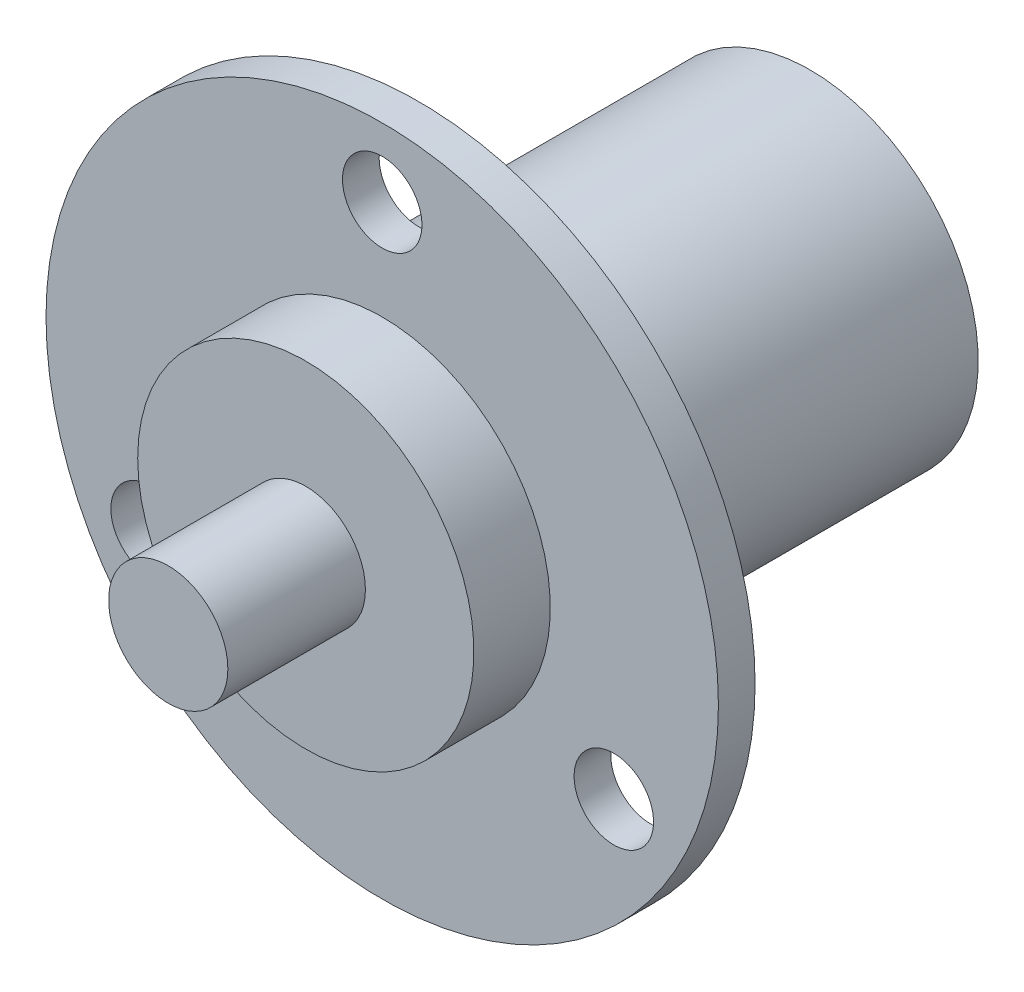
ISO-10303-21;
HEADER;
FILE_DESCRIPTION(('STEP AP214'),'2;1');
FILE_NAME('part.step','',(''),(''),'','','');
FILE_SCHEMA(('AUTOMOTIVE_DESIGN { 1 0 10303 214 1 1 1 1 }'));
ENDSEC;
DATA;
#1=APPLICATION_CONTEXT('core data for automotive mechanical design processes');
#2=APPLICATION_PROTOCOL_DEFINITION('international standard','automotive_design',2000,#1);
#3=PRODUCT_CONTEXT('',#1,'mechanical');
#4=PRODUCT('Part','Part','',(#3));
#5=PRODUCT_RELATED_PRODUCT_CATEGORY('part','',(#4));
#6=PRODUCT_DEFINITION_FORMATION('','',#4);
#7=PRODUCT_DEFINITION_CONTEXT('part definition',#1,'design');
#8=PRODUCT_DEFINITION('design','',#6,#7);
#9=PRODUCT_DEFINITION_SHAPE('','',#8);
#10=(LENGTH_UNIT() NAMED_UNIT(*) SI_UNIT(.MILLI.,.METRE.));
#11=(NAMED_UNIT(*) PLANE_ANGLE_UNIT() SI_UNIT($,.RADIAN.));
#12=(NAMED_UNIT(*) SI_UNIT($,.STERADIAN.) SOLID_ANGLE_UNIT());
#13=UNCERTAINTY_MEASURE_WITH_UNIT(LENGTH_MEASURE(1.E-05),#10,'distance_accuracy_value','');
#14=(GEOMETRIC_REPRESENTATION_CONTEXT(3) GLOBAL_UNCERTAINTY_ASSIGNED_CONTEXT((#13)) GLOBAL_UNIT_ASSIGNED_CONTEXT((#10,
#11,#12)) REPRESENTATION_CONTEXT('',''));
#15=CARTESIAN_POINT('',(0.,0.,0.));
#16=DIRECTION('',(0.,0.,1.));
#17=DIRECTION('',(1.,0.,0.));
#18=AXIS2_PLACEMENT_3D('',#15,#16,#17);
#19=CARTESIAN_POINT('',(0.,17.5,-16.4));
#20=DIRECTION('',(0.,0.,1.));
#21=DIRECTION('',(1.,0.,0.));
#22=AXIS2_PLACEMENT_3D('',#19,#20,#21);
#23=CYLINDRICAL_SURFACE('',#22,2.6);
#24=CARTESIAN_POINT('',(0.,17.5,-16.4));
#25=DIRECTION('',(0.,0.,-1.));
#26=DIRECTION('',(-1.,0.,0.));
#27=AXIS2_PLACEMENT_3D('',#24,#25,#26);
#28=CIRCLE('',#27,2.6);
#29=CARTESIAN_POINT('',(-2.6,17.5,-16.4));
#30=VERTEX_POINT('',#29);
#31=EDGE_CURVE('E48',#30,#30,#28,.T.);
#32=ORIENTED_EDGE('',*,*,#31,.T.);
#33=EDGE_LOOP('',(#32));
#34=FACE_BOUND('',#33,.T.);
#35=CARTESIAN_POINT('',(0.,17.5,-14.));
#36=DIRECTION('',(0.,0.,-1.));
#37=DIRECTION('',(-1.,0.,0.));
#38=AXIS2_PLACEMENT_3D('',#35,#36,#37);
#39=CIRCLE('',#38,2.6);
#40=CARTESIAN_POINT('',(-2.6,17.5,-14.));
#41=VERTEX_POINT('',#40);
#42=EDGE_CURVE('E63',#41,#41,#39,.T.);
#43=ORIENTED_EDGE('',*,*,#42,.F.);
#44=EDGE_LOOP('',(#43));
#45=FACE_BOUND('',#44,.T.);
#46=ADVANCED_FACE('F40',(#34,#45),#23,.F.);
#47=CARTESIAN_POINT('',(-15.1554445662288,-8.74999999999936,-16.4));
#48=DIRECTION('',(0.,0.,1.));
#49=DIRECTION('',(1.,0.,0.));
#50=AXIS2_PLACEMENT_3D('',#47,#48,#49);
#51=CYLINDRICAL_SURFACE('',#50,2.60000000000096);
#52=CARTESIAN_POINT('',(-15.1554445662288,-8.74999999999936,-16.4));
#53=DIRECTION('',(0.,0.,-1.));
#54=DIRECTION('',(-1.,0.,0.));
#55=AXIS2_PLACEMENT_3D('',#52,#53,#54);
#56=CIRCLE('',#55,2.60000000000096);
#57=CARTESIAN_POINT('',(-17.7554445662298,-8.74999999999936,-16.4));
#58=VERTEX_POINT('',#57);
#59=EDGE_CURVE('E53',#58,#58,#56,.T.);
#60=ORIENTED_EDGE('',*,*,#59,.T.);
#61=EDGE_LOOP('',(#60));
#62=FACE_BOUND('',#61,.T.);
#63=CARTESIAN_POINT('',(-15.1554445662288,-8.74999999999936,-14.));
#64=DIRECTION('',(0.,0.,-1.));
#65=DIRECTION('',(-1.,0.,0.));
#66=AXIS2_PLACEMENT_3D('',#63,#64,#65);
#67=CIRCLE('',#66,2.60000000000096);
#68=CARTESIAN_POINT('',(-17.7554445662298,-8.74999999999936,-14.));
#69=VERTEX_POINT('',#68);
#70=EDGE_CURVE('E60',#69,#69,#67,.T.);
#71=ORIENTED_EDGE('',*,*,#70,.F.);
#72=EDGE_LOOP('',(#71));
#73=FACE_BOUND('',#72,.T.);
#74=ADVANCED_FACE('F104',(#62,#73),#51,.F.);
#75=CARTESIAN_POINT('',(15.1554445662266,-8.75000000000065,-16.4));
#76=DIRECTION('',(0.,0.,1.));
#77=DIRECTION('',(1.,0.,0.));
#78=AXIS2_PLACEMENT_3D('',#75,#76,#77);
#79=CYLINDRICAL_SURFACE('',#78,2.60000000000141);
#80=CARTESIAN_POINT('',(15.1554445662266,-8.75000000000065,-16.4));
#81=DIRECTION('',(0.,0.,-1.));
#82=DIRECTION('',(-1.,0.,0.));
#83=AXIS2_PLACEMENT_3D('',#80,#81,#82);
#84=CIRCLE('',#83,2.60000000000141);
#85=CARTESIAN_POINT('',(12.5554445662251,-8.75000000000065,-16.4));
#86=VERTEX_POINT('',#85);
#87=EDGE_CURVE('E68',#86,#86,#84,.T.);
#88=ORIENTED_EDGE('',*,*,#87,.T.);
#89=EDGE_LOOP('',(#88));
#90=FACE_BOUND('',#89,.T.);
#91=CARTESIAN_POINT('',(15.1554445662266,-8.75000000000065,-14.));
#92=DIRECTION('',(0.,0.,-1.));
#93=DIRECTION('',(-1.,0.,0.));
#94=AXIS2_PLACEMENT_3D('',#91,#92,#93);
#95=CIRCLE('',#94,2.60000000000141);
#96=CARTESIAN_POINT('',(12.5554445662251,-8.75000000000065,-14.));
#97=VERTEX_POINT('',#96);
#98=EDGE_CURVE('E57',#97,#97,#95,.T.);
#99=ORIENTED_EDGE('',*,*,#98,.F.);
#100=EDGE_LOOP('',(#99));
#101=FACE_BOUND('',#100,.T.);
#102=ADVANCED_FACE('F42',(#90,#101),#79,.F.);
#103=CARTESIAN_POINT('',(0.,0.,-16.4));
#104=DIRECTION('',(0.,0.,1.));
#105=DIRECTION('',(1.,0.,0.));
#106=AXIS2_PLACEMENT_3D('',#103,#104,#105);
#107=CYLINDRICAL_SURFACE('',#106,22.);
#108=CARTESIAN_POINT('',(0.,0.,-16.4));
#109=DIRECTION('',(0.,0.,-1.));
#110=DIRECTION('',(-1.,0.,0.));
#111=AXIS2_PLACEMENT_3D('',#108,#109,#110);
#112=CIRCLE('',#111,22.);
#113=CARTESIAN_POINT('',(-22.,0.,-16.4));
#114=VERTEX_POINT('',#113);
#115=EDGE_CURVE('E11',#114,#114,#112,.T.);
#116=ORIENTED_EDGE('',*,*,#115,.F.);
#117=EDGE_LOOP('',(#116));
#118=FACE_BOUND('',#117,.T.);
#119=CARTESIAN_POINT('',(0.,0.,-14.));
#120=DIRECTION('',(0.,0.,-1.));
#121=DIRECTION('',(-1.,0.,0.));
#122=AXIS2_PLACEMENT_3D('',#119,#120,#121);
#123=CIRCLE('',#122,22.);
#124=CARTESIAN_POINT('',(-22.,0.,-14.));
#125=VERTEX_POINT('',#124);
#126=EDGE_CURVE('E44',#125,#125,#123,.T.);
#127=ORIENTED_EDGE('',*,*,#126,.T.);
#128=EDGE_LOOP('',(#127));
#129=FACE_BOUND('',#128,.T.);
#130=ADVANCED_FACE('F95',(#118,#129),#107,.T.);
#131=CARTESIAN_POINT('',(0.,0.,-16.4));
#132=DIRECTION('',(0.,0.,-1.));
#133=DIRECTION('',(-1.,0.,0.));
#134=AXIS2_PLACEMENT_3D('',#131,#132,#133);
#135=PLANE('',#134);
#136=CARTESIAN_POINT('',(0.,0.,-16.4));
#137=DIRECTION('',(0.,0.,-1.));
#138=DIRECTION('',(-1.,0.,0.));
#139=AXIS2_PLACEMENT_3D('',#136,#137,#138);
#140=CIRCLE('',#139,11.);
#141=CARTESIAN_POINT('',(-11.,0.,-16.4));
#142=VERTEX_POINT('',#141);
#143=EDGE_CURVE('E77',#142,#142,#140,.T.);
#144=ORIENTED_EDGE('',*,*,#143,.F.);
#145=EDGE_LOOP('',(#144));
#146=FACE_BOUND('',#145,.T.);
#147=ORIENTED_EDGE('',*,*,#87,.F.);
#148=EDGE_LOOP('',(#147));
#149=FACE_BOUND('',#148,.T.);
#150=ORIENTED_EDGE('',*,*,#59,.F.);
#151=EDGE_LOOP('',(#150));
#152=FACE_BOUND('',#151,.T.);
#153=ORIENTED_EDGE('',*,*,#31,.F.);
#154=EDGE_LOOP('',(#153));
#155=FACE_BOUND('',#154,.T.);
#156=ORIENTED_EDGE('',*,*,#115,.T.);
#157=EDGE_LOOP('',(#156));
#158=FACE_BOUND('',#157,.T.);
#159=ADVANCED_FACE('F92',(#146,#149,#152,#155,#158),#135,.T.);
#160=CARTESIAN_POINT('',(0.,0.,-14.));
#161=DIRECTION('',(0.,0.,-1.));
#162=DIRECTION('',(-1.,0.,0.));
#163=AXIS2_PLACEMENT_3D('',#160,#161,#162);
#164=PLANE('',#163);
#165=ORIENTED_EDGE('',*,*,#98,.T.);
#166=EDGE_LOOP('',(#165));
#167=FACE_BOUND('',#166,.T.);
#168=ORIENTED_EDGE('',*,*,#70,.T.);
#169=EDGE_LOOP('',(#168));
#170=FACE_BOUND('',#169,.T.);
#171=ORIENTED_EDGE('',*,*,#42,.T.);
#172=EDGE_LOOP('',(#171));
#173=FACE_BOUND('',#172,.T.);
#174=ORIENTED_EDGE('',*,*,#126,.F.);
#175=EDGE_LOOP('',(#174));
#176=FACE_BOUND('',#175,.T.);
#177=ADVANCED_FACE('F88',(#167,#170,#173,#176),#164,.F.);
#178=CARTESIAN_POINT('',(0.,0.,-42.));
#179=DIRECTION('',(0.,0.,1.));
#180=DIRECTION('',(1.,0.,0.));
#181=AXIS2_PLACEMENT_3D('',#178,#179,#180);
#182=CYLINDRICAL_SURFACE('',#181,11.);
#183=CARTESIAN_POINT('',(0.,0.,-42.));
#184=DIRECTION('',(0.,0.,-1.));
#185=DIRECTION('',(-1.,0.,0.));
#186=AXIS2_PLACEMENT_3D('',#183,#184,#185);
#187=CIRCLE('',#186,11.);
#188=CARTESIAN_POINT('',(-11.,0.,-42.));
#189=VERTEX_POINT('',#188);
#190=EDGE_CURVE('E61',#189,#189,#187,.T.);
#191=ORIENTED_EDGE('',*,*,#190,.F.);
#192=EDGE_LOOP('',(#191));
#193=FACE_BOUND('',#192,.T.);
#194=ORIENTED_EDGE('',*,*,#143,.T.);
#195=EDGE_LOOP('',(#194));
#196=FACE_BOUND('',#195,.T.);
#197=ADVANCED_FACE('F85',(#193,#196),#182,.T.);
#198=CARTESIAN_POINT('',(0.,0.,-42.));
#199=DIRECTION('',(0.,0.,-1.));
#200=DIRECTION('',(-1.,0.,0.));
#201=AXIS2_PLACEMENT_3D('',#198,#199,#200);
#202=PLANE('',#201);
#203=ORIENTED_EDGE('',*,*,#190,.T.);
#204=EDGE_LOOP('',(#203));
#205=FACE_BOUND('',#204,.T.);
#206=ADVANCED_FACE('F83',(#205),#202,.T.);
#207=CLOSED_SHELL('',(#46,#74,#102,#130,#159,#177,#197,#206));
#208=MANIFOLD_SOLID_BREP('B2',#207);
#209=CARTESIAN_POINT('',(0.,0.,-9.));
#210=DIRECTION('',(0.,0.,1.));
#211=DIRECTION('',(1.,0.,0.));
#212=AXIS2_PLACEMENT_3D('',#209,#210,#211);
#213=CYLINDRICAL_SURFACE('',#212,3.9);
#214=CARTESIAN_POINT('',(0.,0.,-9.));
#215=DIRECTION('',(0.,0.,1.));
#216=DIRECTION('',(1.,0.,0.));
#217=AXIS2_PLACEMENT_3D('',#214,#215,#216);
#218=CIRCLE('',#217,3.9);
#219=CARTESIAN_POINT('',(3.9,0.,-9.));
#220=VERTEX_POINT('',#219);
#221=EDGE_CURVE('E179',#220,#220,#218,.T.);
#222=ORIENTED_EDGE('',*,*,#221,.T.);
#223=EDGE_LOOP('',(#222));
#224=FACE_BOUND('',#223,.T.);
#225=CARTESIAN_POINT('',(0.,0.,0.));
#226=DIRECTION('',(0.,0.,1.));
#227=DIRECTION('',(1.,0.,0.));
#228=AXIS2_PLACEMENT_3D('',#225,#226,#227);
#229=CIRCLE('',#228,3.9);
#230=CARTESIAN_POINT('',(3.9,0.,0.));
#231=VERTEX_POINT('',#230);
#232=EDGE_CURVE('E39',#231,#231,#229,.T.);
#233=ORIENTED_EDGE('',*,*,#232,.F.);
#234=EDGE_LOOP('',(#233));
#235=FACE_BOUND('',#234,.T.);
#236=ADVANCED_FACE('F173',(#224,#235),#213,.T.);
#237=CARTESIAN_POINT('',(0.,0.,0.));
#238=DIRECTION('',(0.,0.,1.));
#239=DIRECTION('',(1.,0.,0.));
#240=AXIS2_PLACEMENT_3D('',#237,#238,#239);
#241=PLANE('',#240);
#242=ORIENTED_EDGE('',*,*,#232,.T.);
#243=EDGE_LOOP('',(#242));
#244=FACE_BOUND('',#243,.T.);
#245=ADVANCED_FACE('F207',(#244),#241,.T.);
#246=CARTESIAN_POINT('',(0.,0.,-14.));
#247=DIRECTION('',(0.,0.,1.));
#248=DIRECTION('',(1.,0.,0.));
#249=AXIS2_PLACEMENT_3D('',#246,#247,#248);
#250=CYLINDRICAL_SURFACE('',#249,11.);
#251=CARTESIAN_POINT('',(0.,0.,-14.));
#252=DIRECTION('',(0.,0.,-1.));
#253=DIRECTION('',(-1.,0.,0.));
#254=AXIS2_PLACEMENT_3D('',#251,#252,#253);
#255=CIRCLE('',#254,11.);
#256=CARTESIAN_POINT('',(-11.,0.,-14.));
#257=VERTEX_POINT('',#256);
#258=EDGE_CURVE('E183',#257,#257,#255,.T.);
#259=ORIENTED_EDGE('',*,*,#258,.F.);
#260=EDGE_LOOP('',(#259));
#261=FACE_BOUND('',#260,.T.);
#262=CARTESIAN_POINT('',(0.,0.,-9.));
#263=DIRECTION('',(0.,0.,-1.));
#264=DIRECTION('',(-1.,0.,0.));
#265=AXIS2_PLACEMENT_3D('',#262,#263,#264);
#266=CIRCLE('',#265,11.);
#267=CARTESIAN_POINT('',(-11.,0.,-9.));
#268=VERTEX_POINT('',#267);
#269=EDGE_CURVE('E187',#268,#268,#266,.T.);
#270=ORIENTED_EDGE('',*,*,#269,.T.);
#271=EDGE_LOOP('',(#270));
#272=FACE_BOUND('',#271,.T.);
#273=ADVANCED_FACE('F193',(#261,#272),#250,.T.);
#274=CARTESIAN_POINT('',(0.,0.,-14.));
#275=DIRECTION('',(0.,0.,-1.));
#276=DIRECTION('',(-1.,0.,0.));
#277=AXIS2_PLACEMENT_3D('',#274,#275,#276);
#278=PLANE('',#277);
#279=ORIENTED_EDGE('',*,*,#258,.T.);
#280=EDGE_LOOP('',(#279));
#281=FACE_BOUND('',#280,.T.);
#282=ADVANCED_FACE('F197',(#281),#278,.T.);
#283=CARTESIAN_POINT('',(0.,0.,-9.));
#284=DIRECTION('',(0.,0.,-1.));
#285=DIRECTION('',(-1.,0.,0.));
#286=AXIS2_PLACEMENT_3D('',#283,#284,#285);
#287=PLANE('',#286);
#288=ORIENTED_EDGE('',*,*,#221,.F.);
#289=EDGE_LOOP('',(#288));
#290=FACE_BOUND('',#289,.T.);
#291=ORIENTED_EDGE('',*,*,#269,.F.);
#292=EDGE_LOOP('',(#291));
#293=FACE_BOUND('',#292,.T.);
#294=ADVANCED_FACE('F195',(#290,#293),#287,.F.);
#295=CLOSED_SHELL('',(#236,#245,#273,#282,#294));
#296=MANIFOLD_SOLID_BREP('B6',#295);
#297=ADVANCED_BREP_SHAPE_REPRESENTATION('',(#18,#208,#296),#14);
#298=SHAPE_DEFINITION_REPRESENTATION(#9,#297);
ENDSEC;
END-ISO-10303-21;
